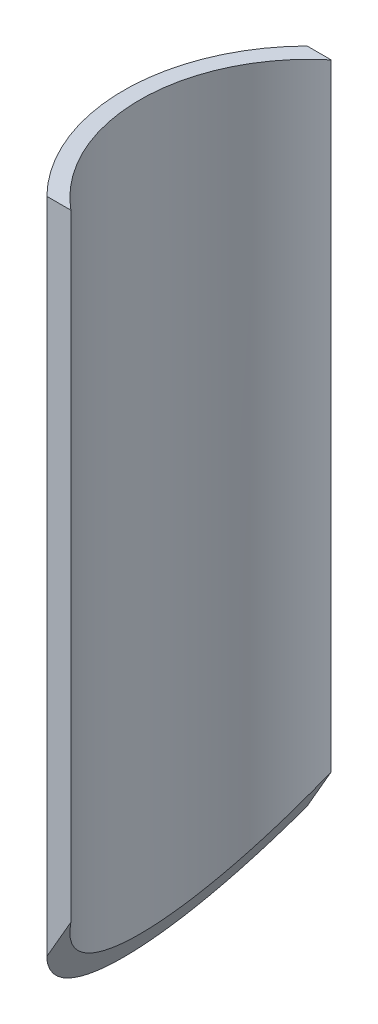
ISO-10303-21;
HEADER;
FILE_DESCRIPTION(('STEP AP214'),'2;1');
FILE_NAME('part.step','',(''),(''),'','','');
FILE_SCHEMA(('AUTOMOTIVE_DESIGN { 1 0 10303 214 1 1 1 1 }'));
ENDSEC;
DATA;
#1=APPLICATION_CONTEXT('core data for automotive mechanical design processes');
#2=APPLICATION_PROTOCOL_DEFINITION('international standard','automotive_design',2000,#1);
#3=PRODUCT_CONTEXT('',#1,'mechanical');
#4=PRODUCT('Part','Part','',(#3));
#5=PRODUCT_RELATED_PRODUCT_CATEGORY('part','',(#4));
#6=PRODUCT_DEFINITION_FORMATION('','',#4);
#7=PRODUCT_DEFINITION_CONTEXT('part definition',#1,'design');
#8=PRODUCT_DEFINITION('design','',#6,#7);
#9=PRODUCT_DEFINITION_SHAPE('','',#8);
#10=(LENGTH_UNIT() NAMED_UNIT(*) SI_UNIT(.MILLI.,.METRE.));
#11=(NAMED_UNIT(*) PLANE_ANGLE_UNIT() SI_UNIT($,.RADIAN.));
#12=(NAMED_UNIT(*) SI_UNIT($,.STERADIAN.) SOLID_ANGLE_UNIT());
#13=UNCERTAINTY_MEASURE_WITH_UNIT(LENGTH_MEASURE(1.E-05),#10,'distance_accuracy_value','');
#14=(GEOMETRIC_REPRESENTATION_CONTEXT(3) GLOBAL_UNCERTAINTY_ASSIGNED_CONTEXT((#13)) GLOBAL_UNIT_ASSIGNED_CONTEXT((#10,
#11,#12)) REPRESENTATION_CONTEXT('',''));
#15=CARTESIAN_POINT('',(0.,0.,0.));
#16=DIRECTION('',(0.,0.,1.));
#17=DIRECTION('',(1.,0.,0.));
#18=AXIS2_PLACEMENT_3D('',#15,#16,#17);
#19=CARTESIAN_POINT('',(57.0100000000007,270.,-39.9999999999995));
#20=DIRECTION('',(0.,0.,1.));
#21=DIRECTION('',(1.,0.,0.));
#22=AXIS2_PLACEMENT_3D('',#19,#20,#21);
#23=PLANE('',#22);
#24=DIRECTION('',(-1.,0.,0.));
#25=VECTOR('',#24,1.);
#26=CARTESIAN_POINT('',(57.0100000000007,270.,-39.9999999999995));
#27=LINE('',#26,#25);
#28=CARTESIAN_POINT('',(-33.2264954516721,270.,-40.0000000000002));
#29=VERTEX_POINT('',#28);
#30=CARTESIAN_POINT('',(-40.6078810084937,270.,-40.0000000000002));
#31=VERTEX_POINT('',#30);
#32=EDGE_CURVE('E92',#29,#31,#27,.T.);
#33=ORIENTED_EDGE('',*,*,#32,.F.);
#34=DIRECTION('',(0.,-1.,0.));
#35=VECTOR('',#34,1.);
#36=CARTESIAN_POINT('',(-33.2264954516721,270.,-40.0000000000002));
#37=LINE('',#36,#35);
#38=CARTESIAN_POINT('',(-33.2264954516721,80.4884974931798,-40.0000000000002));
#39=VERTEX_POINT('',#38);
#40=EDGE_CURVE('E41',#29,#39,#37,.T.);
#41=ORIENTED_EDGE('',*,*,#40,.T.);
#42=DIRECTION('',(0.499999999999995,0.866025403784442,0.));
#43=VECTOR('',#42,1.);
#44=CARTESIAN_POINT('',(76.3069211874375,270.205940238731,-39.9999999999994));
#45=LINE('',#44,#43);
#46=CARTESIAN_POINT('',(-40.6078810084937,67.7035626785096,-40.0000000000002));
#47=VERTEX_POINT('',#46);
#48=EDGE_CURVE('E93',#47,#39,#45,.T.);
#49=ORIENTED_EDGE('',*,*,#48,.F.);
#50=DIRECTION('',(0.,-1.,0.));
#51=VECTOR('',#50,1.);
#52=CARTESIAN_POINT('',(-40.6078810084937,270.,-40.0000000000002));
#53=LINE('',#52,#51);
#54=EDGE_CURVE('E62',#31,#47,#53,.T.);
#55=ORIENTED_EDGE('',*,*,#54,.F.);
#56=EDGE_LOOP('',(#33,#41,#49,#55));
#57=FACE_BOUND('',#56,.T.);
#58=ADVANCED_FACE('F37',(#57),#23,.F.);
#59=CARTESIAN_POINT('',(57.0100000000001,270.,40.0000000000005));
#60=DIRECTION('',(0.,0.,-1.));
#61=DIRECTION('',(-1.,0.,0.));
#62=AXIS2_PLACEMENT_3D('',#59,#60,#61);
#63=PLANE('',#62);
#64=DIRECTION('',(-0.499999999999995,-0.866025403784442,0.));
#65=VECTOR('',#64,1.);
#66=CARTESIAN_POINT('',(76.3069211874373,270.20594023873,40.0000000000006));
#67=LINE('',#66,#65);
#68=CARTESIAN_POINT('',(-33.2264954516725,80.4884974931792,39.9999999999998));
#69=VERTEX_POINT('',#68);
#70=CARTESIAN_POINT('',(-40.6078810084941,67.7035626785089,39.9999999999998));
#71=VERTEX_POINT('',#70);
#72=EDGE_CURVE('E88',#69,#71,#67,.T.);
#73=ORIENTED_EDGE('',*,*,#72,.F.);
#74=DIRECTION('',(0.,-1.,0.));
#75=VECTOR('',#74,1.);
#76=CARTESIAN_POINT('',(-33.2264954516725,270.,39.9999999999998));
#77=LINE('',#76,#75);
#78=CARTESIAN_POINT('',(-33.2264954516725,270.,39.9999999999998));
#79=VERTEX_POINT('',#78);
#80=EDGE_CURVE('E82',#69,#79,#77,.F.);
#81=ORIENTED_EDGE('',*,*,#80,.T.);
#82=DIRECTION('',(-1.,0.,0.));
#83=VECTOR('',#82,1.);
#84=CARTESIAN_POINT('',(-2.79318507107451E-13,270.,40.0000000000001));
#85=LINE('',#84,#83);
#86=CARTESIAN_POINT('',(-40.6078810084941,270.,39.9999999999998));
#87=VERTEX_POINT('',#86);
#88=EDGE_CURVE('E103',#79,#87,#85,.T.);
#89=ORIENTED_EDGE('',*,*,#88,.T.);
#90=DIRECTION('',(0.,-1.,0.));
#91=VECTOR('',#90,1.);
#92=CARTESIAN_POINT('',(-40.6078810084941,270.,39.9999999999998));
#93=LINE('',#92,#91);
#94=EDGE_CURVE('E54',#71,#87,#93,.F.);
#95=ORIENTED_EDGE('',*,*,#94,.F.);
#96=EDGE_LOOP('',(#73,#81,#89,#95));
#97=FACE_BOUND('',#96,.T.);
#98=ADVANCED_FACE('F89',(#97),#63,.F.);
#99=CARTESIAN_POINT('',(76.3069211874375,270.205940238731,-57.01));
#100=DIRECTION('',(-0.866025403784442,0.499999999999995,0.));
#101=DIRECTION('',(-0.499999999999995,-0.866025403784442,0.));
#102=AXIS2_PLACEMENT_3D('',#99,#100,#101);
#103=PLANE('',#102);
#104=CARTESIAN_POINT('',(0.,138.038475772933,0.));
#105=DIRECTION('',(-0.866025403784442,0.499999999999995,0.));
#106=DIRECTION('',(-0.499999999999995,-0.866025403784442,0.));
#107=AXIS2_PLACEMENT_3D('',#104,#105,#106);
#108=ELLIPSE('',#107,114.000000000001,57.);
#109=EDGE_CURVE('E97',#47,#71,#108,.T.);
#110=ORIENTED_EDGE('',*,*,#109,.F.);
#111=ORIENTED_EDGE('',*,*,#48,.T.);
#112=CARTESIAN_POINT('',(0.,138.038475772933,0.));
#113=DIRECTION('',(-0.866025403784442,0.499999999999995,0.));
#114=DIRECTION('',(-0.499999999999995,-0.866025403784442,0.));
#115=AXIS2_PLACEMENT_3D('',#112,#113,#114);
#116=ELLIPSE('',#115,104.000000000001,52.);
#117=EDGE_CURVE('E85',#39,#69,#116,.T.);
#118=ORIENTED_EDGE('',*,*,#117,.T.);
#119=ORIENTED_EDGE('',*,*,#72,.T.);
#120=EDGE_LOOP('',(#110,#111,#118,#119));
#121=FACE_BOUND('',#120,.T.);
#122=ADVANCED_FACE('F95',(#121),#103,.F.);
#123=CARTESIAN_POINT('',(0.,270.,0.));
#124=DIRECTION('',(0.,-1.,0.));
#125=DIRECTION('',(0.,0.,-1.));
#126=AXIS2_PLACEMENT_3D('',#123,#124,#125);
#127=CYLINDRICAL_SURFACE('',#126,52.);
#128=ORIENTED_EDGE('',*,*,#40,.F.);
#129=CARTESIAN_POINT('',(0.,270.,0.));
#130=DIRECTION('',(0.,1.,0.));
#131=DIRECTION('',(0.,0.,1.));
#132=AXIS2_PLACEMENT_3D('',#129,#130,#131);
#133=CIRCLE('',#132,52.);
#134=EDGE_CURVE('E11',#29,#79,#133,.T.);
#135=ORIENTED_EDGE('',*,*,#134,.T.);
#136=ORIENTED_EDGE('',*,*,#80,.F.);
#137=ORIENTED_EDGE('',*,*,#117,.F.);
#138=EDGE_LOOP('',(#128,#135,#136,#137));
#139=FACE_BOUND('',#138,.T.);
#140=ADVANCED_FACE('F83',(#139),#127,.F.);
#141=CARTESIAN_POINT('',(0.,270.,0.));
#142=DIRECTION('',(0.,-1.,0.));
#143=DIRECTION('',(0.,0.,-1.));
#144=AXIS2_PLACEMENT_3D('',#141,#142,#143);
#145=CYLINDRICAL_SURFACE('',#144,57.);
#146=CARTESIAN_POINT('',(0.,270.,0.));
#147=DIRECTION('',(0.,1.,0.));
#148=DIRECTION('',(0.,0.,1.));
#149=AXIS2_PLACEMENT_3D('',#146,#147,#148);
#150=CIRCLE('',#149,57.);
#151=EDGE_CURVE('E46',#31,#87,#150,.T.);
#152=ORIENTED_EDGE('',*,*,#151,.F.);
#153=ORIENTED_EDGE('',*,*,#54,.T.);
#154=ORIENTED_EDGE('',*,*,#109,.T.);
#155=ORIENTED_EDGE('',*,*,#94,.T.);
#156=EDGE_LOOP('',(#152,#153,#154,#155));
#157=FACE_BOUND('',#156,.T.);
#158=ADVANCED_FACE('F111',(#157),#145,.T.);
#159=CARTESIAN_POINT('',(0.,270.,0.));
#160=DIRECTION('',(0.,1.,0.));
#161=DIRECTION('',(0.,0.,1.));
#162=AXIS2_PLACEMENT_3D('',#159,#160,#161);
#163=PLANE('',#162);
#164=ORIENTED_EDGE('',*,*,#134,.F.);
#165=ORIENTED_EDGE('',*,*,#32,.T.);
#166=ORIENTED_EDGE('',*,*,#151,.T.);
#167=ORIENTED_EDGE('',*,*,#88,.F.);
#168=EDGE_LOOP('',(#164,#165,#166,#167));
#169=FACE_BOUND('',#168,.T.);
#170=ADVANCED_FACE('F39',(#169),#163,.T.);
#171=CLOSED_SHELL('',(#58,#98,#122,#140,#158,#170));
#172=MANIFOLD_SOLID_BREP('B2',#171);
#173=ADVANCED_BREP_SHAPE_REPRESENTATION('',(#18,#172),#14);
#174=SHAPE_DEFINITION_REPRESENTATION(#9,#173);
ENDSEC;
END-ISO-10303-21;
